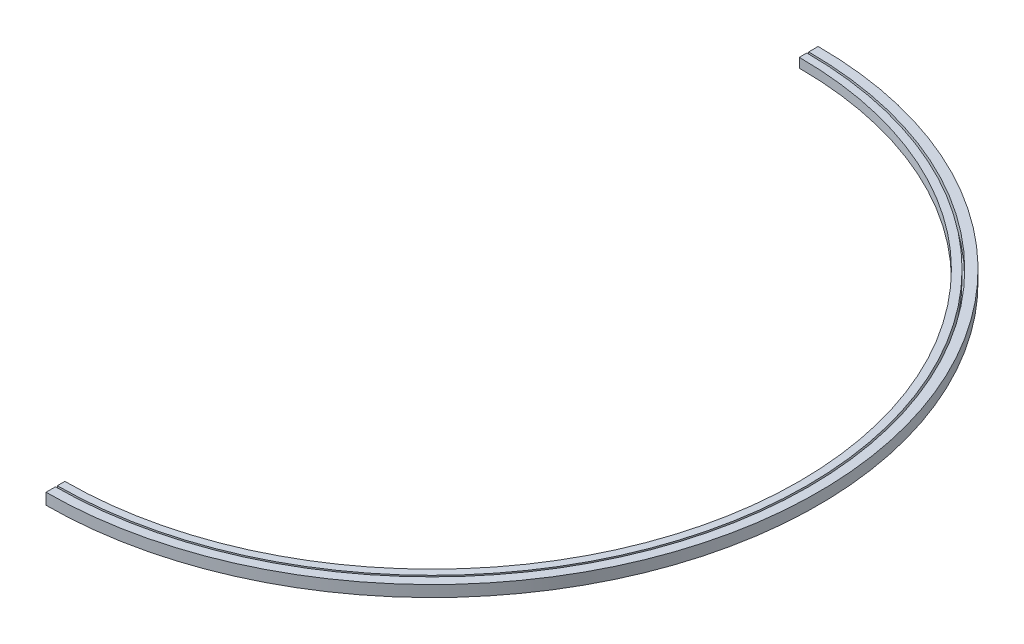
ISO-10303-21;
HEADER;
FILE_DESCRIPTION(('STEP AP214'),'2;1');
FILE_NAME('part.step','',(''),(''),'','','');
FILE_SCHEMA(('AUTOMOTIVE_DESIGN { 1 0 10303 214 1 1 1 1 }'));
ENDSEC;
DATA;
#1=APPLICATION_CONTEXT('core data for automotive mechanical design processes');
#2=APPLICATION_PROTOCOL_DEFINITION('international standard','automotive_design',2000,#1);
#3=PRODUCT_CONTEXT('',#1,'mechanical');
#4=PRODUCT('Part','Part','',(#3));
#5=PRODUCT_RELATED_PRODUCT_CATEGORY('part','',(#4));
#6=PRODUCT_DEFINITION_FORMATION('','',#4);
#7=PRODUCT_DEFINITION_CONTEXT('part definition',#1,'design');
#8=PRODUCT_DEFINITION('design','',#6,#7);
#9=PRODUCT_DEFINITION_SHAPE('','',#8);
#10=(LENGTH_UNIT() NAMED_UNIT(*) SI_UNIT(.MILLI.,.METRE.));
#11=(NAMED_UNIT(*) PLANE_ANGLE_UNIT() SI_UNIT($,.RADIAN.));
#12=(NAMED_UNIT(*) SI_UNIT($,.STERADIAN.) SOLID_ANGLE_UNIT());
#13=UNCERTAINTY_MEASURE_WITH_UNIT(LENGTH_MEASURE(1.E-05),#10,'distance_accuracy_value','');
#14=(GEOMETRIC_REPRESENTATION_CONTEXT(3) GLOBAL_UNCERTAINTY_ASSIGNED_CONTEXT((#13)) GLOBAL_UNIT_ASSIGNED_CONTEXT((#10,
#11,#12)) REPRESENTATION_CONTEXT('',''));
#15=CARTESIAN_POINT('',(0.,0.,0.));
#16=DIRECTION('',(0.,0.,1.));
#17=DIRECTION('',(1.,0.,0.));
#18=AXIS2_PLACEMENT_3D('',#15,#16,#17);
#19=CARTESIAN_POINT('',(0.,100.,0.));
#20=DIRECTION('',(0.,-1.,0.));
#21=DIRECTION('',(0.,0.,-1.));
#22=AXIS2_PLACEMENT_3D('',#19,#20,#21);
#23=CYLINDRICAL_SURFACE('',#22,3900.);
#24=CARTESIAN_POINT('',(0.,0.,0.));
#25=DIRECTION('',(0.,1.,0.));
#26=DIRECTION('',(0.,0.,1.));
#27=AXIS2_PLACEMENT_3D('',#24,#25,#26);
#28=CIRCLE('',#27,3900.);
#29=CARTESIAN_POINT('',(0.,0.,3900.));
#30=VERTEX_POINT('',#29);
#31=CARTESIAN_POINT('',(0.,0.,-3900.));
#32=VERTEX_POINT('',#31);
#33=EDGE_CURVE('E129',#30,#32,#28,.T.);
#34=ORIENTED_EDGE('',*,*,#33,.F.);
#35=DIRECTION('',(0.,-1.,0.));
#36=VECTOR('',#35,1.);
#37=CARTESIAN_POINT('',(0.,100.,3900.));
#38=LINE('',#37,#36);
#39=CARTESIAN_POINT('',(0.,100.,3900.));
#40=VERTEX_POINT('',#39);
#41=EDGE_CURVE('E13',#40,#30,#38,.T.);
#42=ORIENTED_EDGE('',*,*,#41,.F.);
#43=CARTESIAN_POINT('',(0.,100.,0.));
#44=DIRECTION('',(0.,1.,0.));
#45=DIRECTION('',(0.,0.,1.));
#46=AXIS2_PLACEMENT_3D('',#43,#44,#45);
#47=CIRCLE('',#46,3900.);
#48=CARTESIAN_POINT('',(0.,100.,-3900.));
#49=VERTEX_POINT('',#48);
#50=EDGE_CURVE('E118',#40,#49,#47,.T.);
#51=ORIENTED_EDGE('',*,*,#50,.T.);
#52=DIRECTION('',(0.,-1.,0.));
#53=VECTOR('',#52,1.);
#54=CARTESIAN_POINT('',(0.,100.,-3900.));
#55=LINE('',#54,#53);
#56=EDGE_CURVE('E107',#49,#32,#55,.T.);
#57=ORIENTED_EDGE('',*,*,#56,.T.);
#58=EDGE_LOOP('',(#34,#42,#51,#57));
#59=FACE_BOUND('',#58,.T.);
#60=ADVANCED_FACE('F68',(#59),#23,.F.);
#61=CARTESIAN_POINT('',(0.,100.,0.));
#62=DIRECTION('',(1.,0.,0.));
#63=DIRECTION('',(0.,0.,-1.));
#64=AXIS2_PLACEMENT_3D('',#61,#62,#63);
#65=PLANE('',#64);
#66=DIRECTION('',(0.,0.,1.));
#67=VECTOR('',#66,1.);
#68=CARTESIAN_POINT('',(0.,0.,0.));
#69=LINE('',#68,#67);
#70=CARTESIAN_POINT('',(0.,0.,3980.));
#71=VERTEX_POINT('',#70);
#72=EDGE_CURVE('E123',#30,#71,#69,.T.);
#73=ORIENTED_EDGE('',*,*,#72,.T.);
#74=DIRECTION('',(0.,-1.,0.));
#75=VECTOR('',#74,1.);
#76=CARTESIAN_POINT('',(0.,100.,3980.));
#77=LINE('',#76,#75);
#78=CARTESIAN_POINT('',(0.,100.,3980.));
#79=VERTEX_POINT('',#78);
#80=EDGE_CURVE('E76',#79,#71,#77,.T.);
#81=ORIENTED_EDGE('',*,*,#80,.F.);
#82=DIRECTION('',(0.,0.,1.));
#83=VECTOR('',#82,1.);
#84=CARTESIAN_POINT('',(0.,100.,0.));
#85=LINE('',#84,#83);
#86=EDGE_CURVE('E113',#40,#79,#85,.T.);
#87=ORIENTED_EDGE('',*,*,#86,.F.);
#88=ORIENTED_EDGE('',*,*,#41,.T.);
#89=EDGE_LOOP('',(#73,#81,#87,#88));
#90=FACE_BOUND('',#89,.T.);
#91=ADVANCED_FACE('F121',(#90),#65,.F.);
#92=CARTESIAN_POINT('',(0.,100.,0.));
#93=DIRECTION('',(0.,-1.,0.));
#94=DIRECTION('',(0.,0.,-1.));
#95=AXIS2_PLACEMENT_3D('',#92,#93,#94);
#96=CYLINDRICAL_SURFACE('',#95,3980.);
#97=CARTESIAN_POINT('',(0.,0.,0.));
#98=DIRECTION('',(0.,1.,0.));
#99=DIRECTION('',(0.,0.,1.));
#100=AXIS2_PLACEMENT_3D('',#97,#98,#99);
#101=CIRCLE('',#100,3980.);
#102=CARTESIAN_POINT('',(0.,0.,-3980.));
#103=VERTEX_POINT('',#102);
#104=EDGE_CURVE('E100',#71,#103,#101,.T.);
#105=ORIENTED_EDGE('',*,*,#104,.T.);
#106=DIRECTION('',(0.,-1.,0.));
#107=VECTOR('',#106,1.);
#108=CARTESIAN_POINT('',(0.,100.,-3980.));
#109=LINE('',#108,#107);
#110=CARTESIAN_POINT('',(0.,100.,-3980.));
#111=VERTEX_POINT('',#110);
#112=EDGE_CURVE('E124',#111,#103,#109,.T.);
#113=ORIENTED_EDGE('',*,*,#112,.F.);
#114=CARTESIAN_POINT('',(0.,100.,0.));
#115=DIRECTION('',(0.,1.,0.));
#116=DIRECTION('',(0.,0.,1.));
#117=AXIS2_PLACEMENT_3D('',#114,#115,#116);
#118=CIRCLE('',#117,3980.);
#119=EDGE_CURVE('E117',#79,#111,#118,.T.);
#120=ORIENTED_EDGE('',*,*,#119,.F.);
#121=ORIENTED_EDGE('',*,*,#80,.T.);
#122=EDGE_LOOP('',(#105,#113,#120,#121));
#123=FACE_BOUND('',#122,.T.);
#124=ADVANCED_FACE('F125',(#123),#96,.T.);
#125=EDGE_CURVE('E133',#103,#32,#69,.T.);
#126=ORIENTED_EDGE('',*,*,#125,.T.);
#127=ORIENTED_EDGE('',*,*,#56,.F.);
#128=EDGE_CURVE('E84',#111,#49,#85,.T.);
#129=ORIENTED_EDGE('',*,*,#128,.F.);
#130=ORIENTED_EDGE('',*,*,#112,.T.);
#131=EDGE_LOOP('',(#126,#127,#129,#130));
#132=FACE_BOUND('',#131,.T.);
#133=ADVANCED_FACE('F138',(#132),#65,.F.);
#134=CARTESIAN_POINT('',(0.,100.,0.));
#135=DIRECTION('',(0.,1.,0.));
#136=DIRECTION('',(0.,0.,1.));
#137=AXIS2_PLACEMENT_3D('',#134,#135,#136);
#138=PLANE('',#137);
#139=ORIENTED_EDGE('',*,*,#50,.F.);
#140=ORIENTED_EDGE('',*,*,#86,.T.);
#141=ORIENTED_EDGE('',*,*,#119,.T.);
#142=ORIENTED_EDGE('',*,*,#128,.T.);
#143=EDGE_LOOP('',(#139,#140,#141,#142));
#144=FACE_BOUND('',#143,.T.);
#145=ADVANCED_FACE('F115',(#144),#138,.T.);
#146=CARTESIAN_POINT('',(0.,0.,0.));
#147=DIRECTION('',(0.,1.,0.));
#148=DIRECTION('',(0.,0.,1.));
#149=AXIS2_PLACEMENT_3D('',#146,#147,#148);
#150=PLANE('',#149);
#151=ORIENTED_EDGE('',*,*,#33,.T.);
#152=ORIENTED_EDGE('',*,*,#125,.F.);
#153=ORIENTED_EDGE('',*,*,#104,.F.);
#154=ORIENTED_EDGE('',*,*,#72,.F.);
#155=EDGE_LOOP('',(#151,#152,#153,#154));
#156=FACE_BOUND('',#155,.T.);
#157=ADVANCED_FACE('F140',(#156),#150,.F.);
#158=CLOSED_SHELL('',(#60,#91,#124,#133,#145,#157));
#159=MANIFOLD_SOLID_BREP('B2',#158);
#160=CARTESIAN_POINT('',(0.,100.,0.));
#161=DIRECTION('',(1.,0.,0.));
#162=DIRECTION('',(0.,0.,-1.));
#163=AXIS2_PLACEMENT_3D('',#160,#161,#162);
#164=PLANE('',#163);
#165=DIRECTION('',(0.,-1.,0.));
#166=VECTOR('',#165,1.);
#167=CARTESIAN_POINT('',(0.,100.,4000.));
#168=LINE('',#167,#166);
#169=CARTESIAN_POINT('',(0.,100.,4000.));
#170=VERTEX_POINT('',#169);
#171=CARTESIAN_POINT('',(0.,0.,4000.));
#172=VERTEX_POINT('',#171);
#173=EDGE_CURVE('E205',#170,#172,#168,.T.);
#174=ORIENTED_EDGE('',*,*,#173,.T.);
#175=DIRECTION('',(0.,0.,-1.));
#176=VECTOR('',#175,1.);
#177=CARTESIAN_POINT('',(0.,0.,0.));
#178=LINE('',#177,#176);
#179=CARTESIAN_POINT('',(0.,0.,3980.));
#180=VERTEX_POINT('',#179);
#181=EDGE_CURVE('E261',#172,#180,#178,.T.);
#182=ORIENTED_EDGE('',*,*,#181,.T.);
#183=DIRECTION('',(0.,1.,0.));
#184=VECTOR('',#183,1.);
#185=CARTESIAN_POINT('',(0.,-20.,3980.));
#186=LINE('',#185,#184);
#187=CARTESIAN_POINT('',(0.,-20.,3980.));
#188=VERTEX_POINT('',#187);
#189=EDGE_CURVE('E268',#188,#180,#186,.T.);
#190=ORIENTED_EDGE('',*,*,#189,.F.);
#191=DIRECTION('',(0.,0.,-1.));
#192=VECTOR('',#191,1.);
#193=CARTESIAN_POINT('',(0.,-20.,0.));
#194=LINE('',#193,#192);
#195=CARTESIAN_POINT('',(0.,-20.,4100.));
#196=VERTEX_POINT('',#195);
#197=EDGE_CURVE('E253',#196,#188,#194,.T.);
#198=ORIENTED_EDGE('',*,*,#197,.F.);
#199=DIRECTION('',(0.,-1.,0.));
#200=VECTOR('',#199,1.);
#201=CARTESIAN_POINT('',(0.,100.,4100.));
#202=LINE('',#201,#200);
#203=CARTESIAN_POINT('',(0.,100.,4100.));
#204=VERTEX_POINT('',#203);
#205=EDGE_CURVE('E66',#204,#196,#202,.T.);
#206=ORIENTED_EDGE('',*,*,#205,.F.);
#207=DIRECTION('',(0.,0.,1.));
#208=VECTOR('',#207,1.);
#209=CARTESIAN_POINT('',(0.,100.,0.));
#210=LINE('',#209,#208);
#211=EDGE_CURVE('E276',#170,#204,#210,.T.);
#212=ORIENTED_EDGE('',*,*,#211,.F.);
#213=EDGE_LOOP('',(#174,#182,#190,#198,#206,#212));
#214=FACE_BOUND('',#213,.T.);
#215=ADVANCED_FACE('F189',(#214),#164,.F.);
#216=CARTESIAN_POINT('',(0.,100.,0.));
#217=DIRECTION('',(0.,-1.,0.));
#218=DIRECTION('',(0.,0.,-1.));
#219=AXIS2_PLACEMENT_3D('',#216,#217,#218);
#220=CYLINDRICAL_SURFACE('',#219,4100.);
#221=ORIENTED_EDGE('',*,*,#205,.T.);
#222=CARTESIAN_POINT('',(0.,-20.,0.));
#223=DIRECTION('',(0.,-1.,0.));
#224=DIRECTION('',(0.,0.,-1.));
#225=AXIS2_PLACEMENT_3D('',#222,#223,#224);
#226=CIRCLE('',#225,4100.);
#227=CARTESIAN_POINT('',(0.,-20.,-4100.));
#228=VERTEX_POINT('',#227);
#229=EDGE_CURVE('E249',#228,#196,#226,.T.);
#230=ORIENTED_EDGE('',*,*,#229,.F.);
#231=DIRECTION('',(0.,-1.,0.));
#232=VECTOR('',#231,1.);
#233=CARTESIAN_POINT('',(0.,100.,-4100.));
#234=LINE('',#233,#232);
#235=CARTESIAN_POINT('',(0.,100.,-4100.));
#236=VERTEX_POINT('',#235);
#237=EDGE_CURVE('E198',#236,#228,#234,.T.);
#238=ORIENTED_EDGE('',*,*,#237,.F.);
#239=CARTESIAN_POINT('',(0.,100.,0.));
#240=DIRECTION('',(0.,1.,0.));
#241=DIRECTION('',(0.,0.,1.));
#242=AXIS2_PLACEMENT_3D('',#239,#240,#241);
#243=CIRCLE('',#242,4100.);
#244=EDGE_CURVE('E279',#204,#236,#243,.T.);
#245=ORIENTED_EDGE('',*,*,#244,.F.);
#246=EDGE_LOOP('',(#221,#230,#238,#245));
#247=FACE_BOUND('',#246,.T.);
#248=ADVANCED_FACE('F191',(#247),#220,.T.);
#249=ORIENTED_EDGE('',*,*,#237,.T.);
#250=CARTESIAN_POINT('',(0.,-20.,-3980.));
#251=VERTEX_POINT('',#250);
#252=EDGE_CURVE('E242',#251,#228,#194,.T.);
#253=ORIENTED_EDGE('',*,*,#252,.F.);
#254=DIRECTION('',(0.,1.,0.));
#255=VECTOR('',#254,1.);
#256=CARTESIAN_POINT('',(0.,-20.,-3980.));
#257=LINE('',#256,#255);
#258=CARTESIAN_POINT('',(0.,0.,-3980.));
#259=VERTEX_POINT('',#258);
#260=EDGE_CURVE('E264',#251,#259,#257,.T.);
#261=ORIENTED_EDGE('',*,*,#260,.T.);
#262=CARTESIAN_POINT('',(0.,0.,-4000.));
#263=VERTEX_POINT('',#262);
#264=EDGE_CURVE('E271',#259,#263,#178,.T.);
#265=ORIENTED_EDGE('',*,*,#264,.T.);
#266=DIRECTION('',(0.,-1.,0.));
#267=VECTOR('',#266,1.);
#268=CARTESIAN_POINT('',(0.,100.,-4000.));
#269=LINE('',#268,#267);
#270=CARTESIAN_POINT('',(0.,100.,-4000.));
#271=VERTEX_POINT('',#270);
#272=EDGE_CURVE('E247',#271,#263,#269,.T.);
#273=ORIENTED_EDGE('',*,*,#272,.F.);
#274=EDGE_CURVE('E245',#236,#271,#210,.T.);
#275=ORIENTED_EDGE('',*,*,#274,.F.);
#276=EDGE_LOOP('',(#249,#253,#261,#265,#273,#275));
#277=FACE_BOUND('',#276,.T.);
#278=ADVANCED_FACE('F240',(#277),#164,.F.);
#279=CARTESIAN_POINT('',(0.,100.,0.));
#280=DIRECTION('',(0.,-1.,0.));
#281=DIRECTION('',(0.,0.,-1.));
#282=AXIS2_PLACEMENT_3D('',#279,#280,#281);
#283=CYLINDRICAL_SURFACE('',#282,4000.);
#284=CARTESIAN_POINT('',(0.,0.,0.));
#285=DIRECTION('',(0.,1.,0.));
#286=DIRECTION('',(0.,0.,1.));
#287=AXIS2_PLACEMENT_3D('',#284,#285,#286);
#288=CIRCLE('',#287,4000.);
#289=EDGE_CURVE('E275',#172,#263,#288,.T.);
#290=ORIENTED_EDGE('',*,*,#289,.F.);
#291=ORIENTED_EDGE('',*,*,#173,.F.);
#292=CARTESIAN_POINT('',(0.,100.,0.));
#293=DIRECTION('',(0.,1.,0.));
#294=DIRECTION('',(0.,0.,1.));
#295=AXIS2_PLACEMENT_3D('',#292,#293,#294);
#296=CIRCLE('',#295,4000.);
#297=EDGE_CURVE('E281',#170,#271,#296,.T.);
#298=ORIENTED_EDGE('',*,*,#297,.T.);
#299=ORIENTED_EDGE('',*,*,#272,.T.);
#300=EDGE_LOOP('',(#290,#291,#298,#299));
#301=FACE_BOUND('',#300,.T.);
#302=ADVANCED_FACE('F286',(#301),#283,.F.);
#303=CARTESIAN_POINT('',(0.,100.,0.));
#304=DIRECTION('',(0.,1.,0.));
#305=DIRECTION('',(0.,0.,1.));
#306=AXIS2_PLACEMENT_3D('',#303,#304,#305);
#307=PLANE('',#306);
#308=ORIENTED_EDGE('',*,*,#211,.T.);
#309=ORIENTED_EDGE('',*,*,#244,.T.);
#310=ORIENTED_EDGE('',*,*,#274,.T.);
#311=ORIENTED_EDGE('',*,*,#297,.F.);
#312=EDGE_LOOP('',(#308,#309,#310,#311));
#313=FACE_BOUND('',#312,.T.);
#314=ADVANCED_FACE('F296',(#313),#307,.T.);
#315=CARTESIAN_POINT('',(0.,0.,0.));
#316=DIRECTION('',(0.,-1.,0.));
#317=DIRECTION('',(0.,0.,-1.));
#318=AXIS2_PLACEMENT_3D('',#315,#316,#317);
#319=PLANE('',#318);
#320=ORIENTED_EDGE('',*,*,#181,.F.);
#321=ORIENTED_EDGE('',*,*,#289,.T.);
#322=ORIENTED_EDGE('',*,*,#264,.F.);
#323=CARTESIAN_POINT('',(0.,0.,0.));
#324=DIRECTION('',(0.,-1.,0.));
#325=DIRECTION('',(0.,0.,-1.));
#326=AXIS2_PLACEMENT_3D('',#323,#324,#325);
#327=CIRCLE('',#326,3980.);
#328=EDGE_CURVE('E258',#259,#180,#327,.T.);
#329=ORIENTED_EDGE('',*,*,#328,.T.);
#330=EDGE_LOOP('',(#320,#321,#322,#329));
#331=FACE_BOUND('',#330,.T.);
#332=ADVANCED_FACE('F291',(#331),#319,.F.);
#333=CARTESIAN_POINT('',(0.,-20.,0.));
#334=DIRECTION('',(0.,1.,0.));
#335=DIRECTION('',(0.,0.,1.));
#336=AXIS2_PLACEMENT_3D('',#333,#334,#335);
#337=CYLINDRICAL_SURFACE('',#336,3980.);
#338=ORIENTED_EDGE('',*,*,#328,.F.);
#339=ORIENTED_EDGE('',*,*,#260,.F.);
#340=CARTESIAN_POINT('',(0.,-20.,0.));
#341=DIRECTION('',(0.,-1.,0.));
#342=DIRECTION('',(0.,0.,-1.));
#343=AXIS2_PLACEMENT_3D('',#340,#341,#342);
#344=CIRCLE('',#343,3980.);
#345=EDGE_CURVE('E257',#251,#188,#344,.T.);
#346=ORIENTED_EDGE('',*,*,#345,.T.);
#347=ORIENTED_EDGE('',*,*,#189,.T.);
#348=EDGE_LOOP('',(#338,#339,#346,#347));
#349=FACE_BOUND('',#348,.T.);
#350=ADVANCED_FACE('F293',(#349),#337,.F.);
#351=CARTESIAN_POINT('',(0.,-20.,0.));
#352=DIRECTION('',(0.,-1.,0.));
#353=DIRECTION('',(0.,0.,-1.));
#354=AXIS2_PLACEMENT_3D('',#351,#352,#353);
#355=PLANE('',#354);
#356=ORIENTED_EDGE('',*,*,#252,.T.);
#357=ORIENTED_EDGE('',*,*,#229,.T.);
#358=ORIENTED_EDGE('',*,*,#197,.T.);
#359=ORIENTED_EDGE('',*,*,#345,.F.);
#360=EDGE_LOOP('',(#356,#357,#358,#359));
#361=FACE_BOUND('',#360,.T.);
#362=ADVANCED_FACE('F255',(#361),#355,.T.);
#363=CLOSED_SHELL('',(#215,#248,#278,#302,#314,#332,#350,#362));
#364=MANIFOLD_SOLID_BREP('B7',#363);
#365=ADVANCED_BREP_SHAPE_REPRESENTATION('',(#18,#159,#364),#14);
#366=SHAPE_DEFINITION_REPRESENTATION(#9,#365);
ENDSEC;
END-ISO-10303-21;
